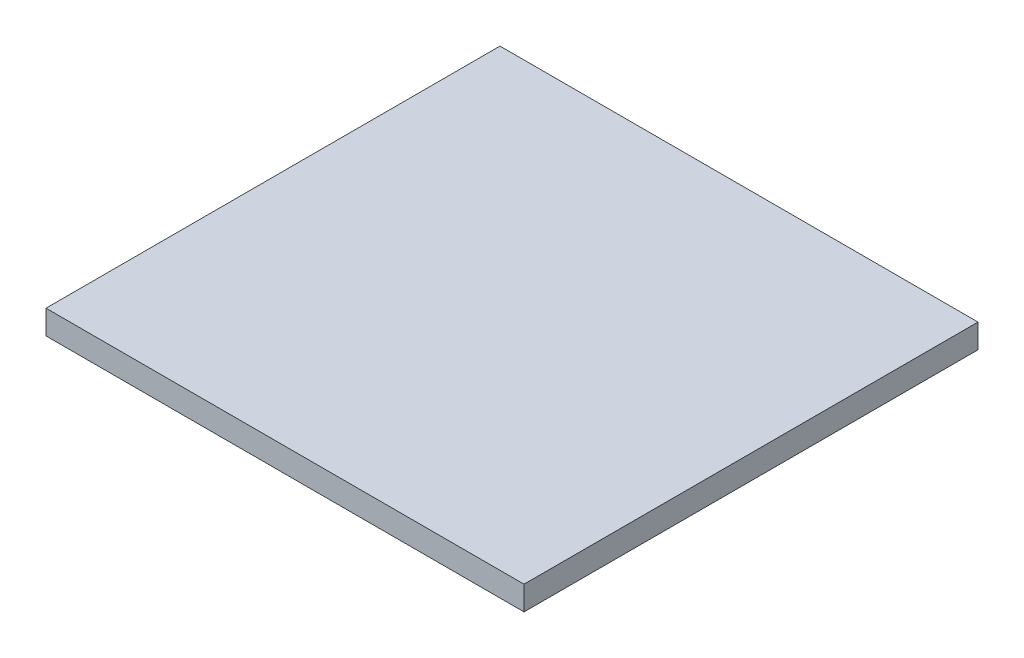
ISO-10303-21;
HEADER;
FILE_DESCRIPTION(('STEP AP214'),'2;1');
FILE_NAME('part.step','',(''),(''),'','','');
FILE_SCHEMA(('AUTOMOTIVE_DESIGN { 1 0 10303 214 1 1 1 1 }'));
ENDSEC;
DATA;
#1=APPLICATION_CONTEXT('core data for automotive mechanical design processes');
#2=APPLICATION_PROTOCOL_DEFINITION('international standard','automotive_design',2000,#1);
#3=PRODUCT_CONTEXT('',#1,'mechanical');
#4=PRODUCT('Part','Part','',(#3));
#5=PRODUCT_RELATED_PRODUCT_CATEGORY('part','',(#4));
#6=PRODUCT_DEFINITION_FORMATION('','',#4);
#7=PRODUCT_DEFINITION_CONTEXT('part definition',#1,'design');
#8=PRODUCT_DEFINITION('design','',#6,#7);
#9=PRODUCT_DEFINITION_SHAPE('','',#8);
#10=(LENGTH_UNIT() NAMED_UNIT(*) SI_UNIT(.MILLI.,.METRE.));
#11=(NAMED_UNIT(*) PLANE_ANGLE_UNIT() SI_UNIT($,.RADIAN.));
#12=(NAMED_UNIT(*) SI_UNIT($,.STERADIAN.) SOLID_ANGLE_UNIT());
#13=UNCERTAINTY_MEASURE_WITH_UNIT(LENGTH_MEASURE(1.E-05),#10,'distance_accuracy_value','');
#14=(GEOMETRIC_REPRESENTATION_CONTEXT(3) GLOBAL_UNCERTAINTY_ASSIGNED_CONTEXT((#13)) GLOBAL_UNIT_ASSIGNED_CONTEXT((#10,
#11,#12)) REPRESENTATION_CONTEXT('',''));
#15=CARTESIAN_POINT('',(0.,0.,0.));
#16=DIRECTION('',(0.,0.,1.));
#17=DIRECTION('',(1.,0.,0.));
#18=AXIS2_PLACEMENT_3D('',#15,#16,#17);
#19=CARTESIAN_POINT('',(179.,18.,-170.));
#20=DIRECTION('',(-1.,0.,0.));
#21=DIRECTION('',(0.,0.,1.));
#22=AXIS2_PLACEMENT_3D('',#19,#20,#21);
#23=PLANE('',#22);
#24=DIRECTION('',(0.,0.,-1.));
#25=VECTOR('',#24,1.);
#26=CARTESIAN_POINT('',(179.,0.,-170.));
#27=LINE('',#26,#25);
#28=CARTESIAN_POINT('',(179.,0.,170.));
#29=VERTEX_POINT('',#28);
#30=CARTESIAN_POINT('',(179.,0.,-170.));
#31=VERTEX_POINT('',#30);
#32=EDGE_CURVE('E95',#29,#31,#27,.T.);
#33=ORIENTED_EDGE('',*,*,#32,.T.);
#34=DIRECTION('',(0.,-1.,0.));
#35=VECTOR('',#34,1.);
#36=CARTESIAN_POINT('',(179.,18.,-170.));
#37=LINE('',#36,#35);
#38=CARTESIAN_POINT('',(179.,18.,-170.));
#39=VERTEX_POINT('',#38);
#40=EDGE_CURVE('E11',#39,#31,#37,.T.);
#41=ORIENTED_EDGE('',*,*,#40,.F.);
#42=DIRECTION('',(0.,0.,-1.));
#43=VECTOR('',#42,1.);
#44=CARTESIAN_POINT('',(179.,18.,-170.));
#45=LINE('',#44,#43);
#46=CARTESIAN_POINT('',(179.,18.,170.));
#47=VERTEX_POINT('',#46);
#48=EDGE_CURVE('E83',#47,#39,#45,.T.);
#49=ORIENTED_EDGE('',*,*,#48,.F.);
#50=DIRECTION('',(0.,-1.,0.));
#51=VECTOR('',#50,1.);
#52=CARTESIAN_POINT('',(179.,18.,170.));
#53=LINE('',#52,#51);
#54=EDGE_CURVE('E91',#47,#29,#53,.T.);
#55=ORIENTED_EDGE('',*,*,#54,.T.);
#56=EDGE_LOOP('',(#33,#41,#49,#55));
#57=FACE_BOUND('',#56,.T.);
#58=ADVANCED_FACE('F32',(#57),#23,.F.);
#59=CARTESIAN_POINT('',(-179.,18.,-170.));
#60=DIRECTION('',(0.,0.,1.));
#61=DIRECTION('',(1.,0.,0.));
#62=AXIS2_PLACEMENT_3D('',#59,#60,#61);
#63=PLANE('',#62);
#64=DIRECTION('',(-1.,0.,0.));
#65=VECTOR('',#64,1.);
#66=CARTESIAN_POINT('',(-179.,0.,-170.));
#67=LINE('',#66,#65);
#68=CARTESIAN_POINT('',(-179.,0.,-170.));
#69=VERTEX_POINT('',#68);
#70=EDGE_CURVE('E87',#31,#69,#67,.T.);
#71=ORIENTED_EDGE('',*,*,#70,.T.);
#72=DIRECTION('',(0.,-1.,0.));
#73=VECTOR('',#72,1.);
#74=CARTESIAN_POINT('',(-179.,18.,-170.));
#75=LINE('',#74,#73);
#76=CARTESIAN_POINT('',(-179.,18.,-170.));
#77=VERTEX_POINT('',#76);
#78=EDGE_CURVE('E40',#77,#69,#75,.T.);
#79=ORIENTED_EDGE('',*,*,#78,.F.);
#80=DIRECTION('',(-1.,0.,0.));
#81=VECTOR('',#80,1.);
#82=CARTESIAN_POINT('',(-179.,18.,-170.));
#83=LINE('',#82,#81);
#84=EDGE_CURVE('E78',#39,#77,#83,.T.);
#85=ORIENTED_EDGE('',*,*,#84,.F.);
#86=ORIENTED_EDGE('',*,*,#40,.T.);
#87=EDGE_LOOP('',(#71,#79,#85,#86));
#88=FACE_BOUND('',#87,.T.);
#89=ADVANCED_FACE('F86',(#88),#63,.F.);
#90=CARTESIAN_POINT('',(-179.,18.,-170.));
#91=DIRECTION('',(1.,0.,0.));
#92=DIRECTION('',(0.,0.,-1.));
#93=AXIS2_PLACEMENT_3D('',#90,#91,#92);
#94=PLANE('',#93);
#95=DIRECTION('',(0.,0.,1.));
#96=VECTOR('',#95,1.);
#97=CARTESIAN_POINT('',(-179.,0.,-170.));
#98=LINE('',#97,#96);
#99=CARTESIAN_POINT('',(-179.,0.,170.));
#100=VERTEX_POINT('',#99);
#101=EDGE_CURVE('E65',#69,#100,#98,.T.);
#102=ORIENTED_EDGE('',*,*,#101,.T.);
#103=DIRECTION('',(0.,-1.,0.));
#104=VECTOR('',#103,1.);
#105=CARTESIAN_POINT('',(-179.,18.,170.));
#106=LINE('',#105,#104);
#107=CARTESIAN_POINT('',(-179.,18.,170.));
#108=VERTEX_POINT('',#107);
#109=EDGE_CURVE('E88',#108,#100,#106,.T.);
#110=ORIENTED_EDGE('',*,*,#109,.F.);
#111=DIRECTION('',(0.,0.,1.));
#112=VECTOR('',#111,1.);
#113=CARTESIAN_POINT('',(-179.,18.,-170.));
#114=LINE('',#113,#112);
#115=EDGE_CURVE('E81',#77,#108,#114,.T.);
#116=ORIENTED_EDGE('',*,*,#115,.F.);
#117=ORIENTED_EDGE('',*,*,#78,.T.);
#118=EDGE_LOOP('',(#102,#110,#116,#117));
#119=FACE_BOUND('',#118,.T.);
#120=ADVANCED_FACE('F89',(#119),#94,.F.);
#121=CARTESIAN_POINT('',(-179.,18.,170.));
#122=DIRECTION('',(0.,0.,-1.));
#123=DIRECTION('',(-1.,0.,0.));
#124=AXIS2_PLACEMENT_3D('',#121,#122,#123);
#125=PLANE('',#124);
#126=DIRECTION('',(1.,0.,0.));
#127=VECTOR('',#126,1.);
#128=CARTESIAN_POINT('',(-179.,0.,170.));
#129=LINE('',#128,#127);
#130=EDGE_CURVE('E71',#100,#29,#129,.T.);
#131=ORIENTED_EDGE('',*,*,#130,.T.);
#132=ORIENTED_EDGE('',*,*,#54,.F.);
#133=DIRECTION('',(1.,0.,0.));
#134=VECTOR('',#133,1.);
#135=CARTESIAN_POINT('',(-179.,18.,170.));
#136=LINE('',#135,#134);
#137=EDGE_CURVE('E48',#108,#47,#136,.T.);
#138=ORIENTED_EDGE('',*,*,#137,.F.);
#139=ORIENTED_EDGE('',*,*,#109,.T.);
#140=EDGE_LOOP('',(#131,#132,#138,#139));
#141=FACE_BOUND('',#140,.T.);
#142=ADVANCED_FACE('F102',(#141),#125,.F.);
#143=CARTESIAN_POINT('',(0.,18.,0.));
#144=DIRECTION('',(0.,1.,0.));
#145=DIRECTION('',(0.,0.,1.));
#146=AXIS2_PLACEMENT_3D('',#143,#144,#145);
#147=PLANE('',#146);
#148=ORIENTED_EDGE('',*,*,#48,.T.);
#149=ORIENTED_EDGE('',*,*,#84,.T.);
#150=ORIENTED_EDGE('',*,*,#115,.T.);
#151=ORIENTED_EDGE('',*,*,#137,.T.);
#152=EDGE_LOOP('',(#148,#149,#150,#151));
#153=FACE_BOUND('',#152,.T.);
#154=ADVANCED_FACE('F79',(#153),#147,.T.);
#155=CARTESIAN_POINT('',(0.,0.,0.));
#156=DIRECTION('',(0.,1.,0.));
#157=DIRECTION('',(0.,0.,1.));
#158=AXIS2_PLACEMENT_3D('',#155,#156,#157);
#159=PLANE('',#158);
#160=ORIENTED_EDGE('',*,*,#32,.F.);
#161=ORIENTED_EDGE('',*,*,#130,.F.);
#162=ORIENTED_EDGE('',*,*,#101,.F.);
#163=ORIENTED_EDGE('',*,*,#70,.F.);
#164=EDGE_LOOP('',(#160,#161,#162,#163));
#165=FACE_BOUND('',#164,.T.);
#166=ADVANCED_FACE('F105',(#165),#159,.F.);
#167=CLOSED_SHELL('',(#58,#89,#120,#142,#154,#166));
#168=MANIFOLD_SOLID_BREP('B2',#167);
#169=ADVANCED_BREP_SHAPE_REPRESENTATION('',(#18,#168),#14);
#170=SHAPE_DEFINITION_REPRESENTATION(#9,#169);
ENDSEC;
END-ISO-10303-21;
